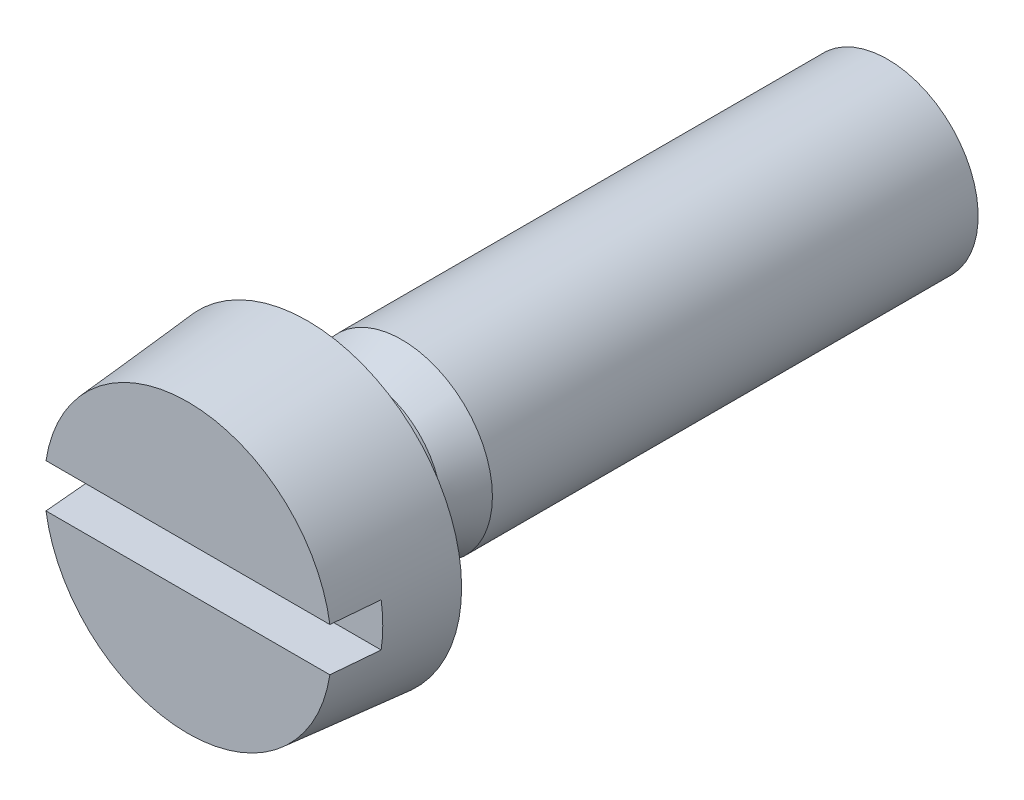
ISO-10303-21;
HEADER;
FILE_DESCRIPTION(('STEP AP214'),'2;1');
FILE_NAME('part.step','',(''),(''),'','','');
FILE_SCHEMA(('AUTOMOTIVE_DESIGN { 1 0 10303 214 1 1 1 1 }'));
ENDSEC;
DATA;
#1=APPLICATION_CONTEXT('core data for automotive mechanical design processes');
#2=APPLICATION_PROTOCOL_DEFINITION('international standard','automotive_design',2000,#1);
#3=PRODUCT_CONTEXT('',#1,'mechanical');
#4=PRODUCT('Part','Part','',(#3));
#5=PRODUCT_RELATED_PRODUCT_CATEGORY('part','',(#4));
#6=PRODUCT_DEFINITION_FORMATION('','',#4);
#7=PRODUCT_DEFINITION_CONTEXT('part definition',#1,'design');
#8=PRODUCT_DEFINITION('design','',#6,#7);
#9=PRODUCT_DEFINITION_SHAPE('','',#8);
#10=(LENGTH_UNIT() NAMED_UNIT(*) SI_UNIT(.MILLI.,.METRE.));
#11=(NAMED_UNIT(*) PLANE_ANGLE_UNIT() SI_UNIT($,.RADIAN.));
#12=(NAMED_UNIT(*) SI_UNIT($,.STERADIAN.) SOLID_ANGLE_UNIT());
#13=UNCERTAINTY_MEASURE_WITH_UNIT(LENGTH_MEASURE(1.E-05),#10,'distance_accuracy_value','');
#14=(GEOMETRIC_REPRESENTATION_CONTEXT(3) GLOBAL_UNCERTAINTY_ASSIGNED_CONTEXT((#13)) GLOBAL_UNIT_ASSIGNED_CONTEXT((#10,
#11,#12)) REPRESENTATION_CONTEXT('',''));
#15=CARTESIAN_POINT('',(0.,0.,0.));
#16=DIRECTION('',(0.,0.,1.));
#17=DIRECTION('',(1.,0.,0.));
#18=AXIS2_PLACEMENT_3D('',#15,#16,#17);
#19=CARTESIAN_POINT('',(0.,0.,-16.));
#20=DIRECTION('',(0.,0.,1.));
#21=DIRECTION('',(1.,0.,0.));
#22=AXIS2_PLACEMENT_3D('',#19,#20,#21);
#23=PLANE('',#22);
#24=CARTESIAN_POINT('',(0.,0.,-16.));
#25=DIRECTION('',(0.,0.,-1.));
#26=DIRECTION('',(-1.,0.,0.));
#27=AXIS2_PLACEMENT_3D('',#24,#25,#26);
#28=CIRCLE('',#27,2.5);
#29=CARTESIAN_POINT('',(-2.5,0.,-16.));
#30=VERTEX_POINT('',#29);
#31=EDGE_CURVE('E20',#30,#30,#28,.F.);
#32=ORIENTED_EDGE('',*,*,#31,.F.);
#33=EDGE_LOOP('',(#32));
#34=FACE_BOUND('',#33,.T.);
#35=ADVANCED_FACE('F16',(#34),#23,.F.);
#36=CARTESIAN_POINT('',(0.,0.,-2.6));
#37=DIRECTION('',(0.,0.,-1.));
#38=DIRECTION('',(-1.,0.,0.));
#39=AXIS2_PLACEMENT_3D('',#36,#37,#38);
#40=CYLINDRICAL_SURFACE('',#39,2.5);
#41=CARTESIAN_POINT('',(0.,0.,-2.60000000014315));
#42=DIRECTION('',(0.,0.,-1.));
#43=DIRECTION('',(1.,0.,0.));
#44=AXIS2_PLACEMENT_3D('',#41,#42,#43);
#45=CIRCLE('',#44,2.49999999979878);
#46=CARTESIAN_POINT('',(2.49999999979878,0.,-2.60000000014315));
#47=VERTEX_POINT('',#46);
#48=EDGE_CURVE('E142',#47,#47,#45,.F.);
#49=ORIENTED_EDGE('',*,*,#48,.F.);
#50=EDGE_LOOP('',(#49));
#51=FACE_BOUND('',#50,.T.);
#52=ORIENTED_EDGE('',*,*,#31,.T.);
#53=EDGE_LOOP('',(#52));
#54=FACE_BOUND('',#53,.T.);
#55=ADVANCED_FACE('F129',(#51,#54),#40,.T.);
#56=CARTESIAN_POINT('',(0.,0.,-2.60000000014315));
#57=DIRECTION('',(0.,0.,-1.));
#58=DIRECTION('',(-1.,0.,0.));
#59=AXIS2_PLACEMENT_3D('',#56,#57,#58);
#60=CONICAL_SURFACE('',#59,2.49999999979878,0.380506376686039);
#61=CARTESIAN_POINT('',(0.,0.,-1.6));
#62=DIRECTION('',(0.,0.,-1.));
#63=DIRECTION('',(-1.,0.,0.));
#64=AXIS2_PLACEMENT_3D('',#61,#62,#63);
#65=CIRCLE('',#64,2.1);
#66=CARTESIAN_POINT('',(-2.1,0.,-1.6));
#67=VERTEX_POINT('',#66);
#68=EDGE_CURVE('E75',#67,#67,#65,.F.);
#69=ORIENTED_EDGE('',*,*,#68,.F.);
#70=EDGE_LOOP('',(#69));
#71=FACE_BOUND('',#70,.T.);
#72=ORIENTED_EDGE('',*,*,#48,.T.);
#73=EDGE_LOOP('',(#72));
#74=FACE_BOUND('',#73,.T.);
#75=ADVANCED_FACE('F125',(#71,#74),#60,.T.);
#76=CARTESIAN_POINT('',(0.,0.,-0.2));
#77=DIRECTION('',(0.,0.,-1.));
#78=DIRECTION('',(-1.,0.,0.));
#79=AXIS2_PLACEMENT_3D('',#76,#77,#78);
#80=CYLINDRICAL_SURFACE('',#79,2.1);
#81=CARTESIAN_POINT('',(0.,0.,-0.2));
#82=DIRECTION('',(0.,0.,1.));
#83=DIRECTION('',(1.,0.,0.));
#84=AXIS2_PLACEMENT_3D('',#81,#82,#83);
#85=CIRCLE('',#84,2.1);
#86=CARTESIAN_POINT('',(2.1,0.,-0.2));
#87=VERTEX_POINT('',#86);
#88=EDGE_CURVE('E65',#87,#87,#85,.T.);
#89=ORIENTED_EDGE('',*,*,#88,.F.);
#90=EDGE_LOOP('',(#89));
#91=FACE_BOUND('',#90,.T.);
#92=ORIENTED_EDGE('',*,*,#68,.T.);
#93=EDGE_LOOP('',(#92));
#94=FACE_BOUND('',#93,.T.);
#95=ADVANCED_FACE('F122',(#91,#94),#80,.T.);
#96=CARTESIAN_POINT('',(4.25,0.,2.));
#97=DIRECTION('',(0.,0.,-1.));
#98=DIRECTION('',(-1.,0.,0.));
#99=AXIS2_PLACEMENT_3D('',#96,#97,#98);
#100=PLANE('',#99);
#101=DIRECTION('',(1.,0.,0.));
#102=VECTOR('',#101,1.);
#103=CARTESIAN_POINT('',(0.,-0.6,2.));
#104=LINE('',#103,#102);
#105=CARTESIAN_POINT('',(4.03060910847677,-0.6,2.00000000000477));
#106=VERTEX_POINT('',#105);
#107=CARTESIAN_POINT('',(-4.03060910847658,-0.6,2.00000000000704));
#108=VERTEX_POINT('',#107);
#109=EDGE_CURVE('E73',#106,#108,#104,.F.);
#110=ORIENTED_EDGE('',*,*,#109,.F.);
#111=CARTESIAN_POINT('',(0.,0.,2.00000000000955));
#112=DIRECTION('',(0.,0.,-1.));
#113=DIRECTION('',(-1.,0.,0.));
#114=AXIS2_PLACEMENT_3D('',#111,#112,#113);
#115=CIRCLE('',#114,4.07502267298386);
#116=CARTESIAN_POINT('',(4.03060910847658,0.6,2.00000000000704));
#117=VERTEX_POINT('',#116);
#118=EDGE_CURVE('E57',#117,#106,#115,.T.);
#119=ORIENTED_EDGE('',*,*,#118,.F.);
#120=DIRECTION('',(1.,0.,0.));
#121=VECTOR('',#120,1.);
#122=CARTESIAN_POINT('',(0.,0.6,2.));
#123=LINE('',#122,#121);
#124=CARTESIAN_POINT('',(-4.03060910847677,0.6,2.00000000000477));
#125=VERTEX_POINT('',#124);
#126=EDGE_CURVE('E64',#117,#125,#123,.F.);
#127=ORIENTED_EDGE('',*,*,#126,.T.);
#128=CARTESIAN_POINT('',(0.,0.,2.00000000000955));
#129=DIRECTION('',(0.,0.,-1.));
#130=DIRECTION('',(-1.,0.,0.));
#131=AXIS2_PLACEMENT_3D('',#128,#129,#130);
#132=CIRCLE('',#131,4.07502267298386);
#133=EDGE_CURVE('E74',#108,#125,#132,.T.);
#134=ORIENTED_EDGE('',*,*,#133,.F.);
#135=EDGE_LOOP('',(#110,#119,#127,#134));
#136=FACE_BOUND('',#135,.T.);
#137=ADVANCED_FACE('F69',(#136),#100,.F.);
#138=CARTESIAN_POINT('',(0.,0.,-0.2));
#139=DIRECTION('',(0.,0.,-1.));
#140=DIRECTION('',(-1.,0.,0.));
#141=AXIS2_PLACEMENT_3D('',#138,#139,#140);
#142=TOROIDAL_SURFACE('',#141,2.3,0.2);
#143=ORIENTED_EDGE('',*,*,#88,.T.);
#144=EDGE_LOOP('',(#143));
#145=FACE_BOUND('',#144,.T.);
#146=CARTESIAN_POINT('',(2.3,0.,0.));
#147=CARTESIAN_POINT('',(2.29999409618129,0.0364102173988052,0.));
#148=CARTESIAN_POINT('',(2.29915003783443,0.072821840053788,0.));
#149=CARTESIAN_POINT('',(2.29577050631826,0.145323675056289,0.));
#150=CARTESIAN_POINT('',(2.29324631319132,0.181414415065721,0.));
#151=CARTESIAN_POINT('',(2.28650710486973,0.253274883007128,0.));
#152=CARTESIAN_POINT('',(2.28229972774912,0.289045324698426,0.));
#153=CARTESIAN_POINT('',(2.27219868300902,0.36026482452331,0.));
#154=CARTESIAN_POINT('',(2.26630885383113,0.395714426838045,0.));
#155=CARTESIAN_POINT('',(2.25284655643153,0.466292558170426,0.));
#156=CARTESIAN_POINT('',(2.24527409520704,0.501421088522617,0.));
#157=CARTESIAN_POINT('',(2.22845042494949,0.571357620808431,0.));
#158=CARTESIAN_POINT('',(2.21919546007048,0.606164718764165,0.));
#159=CARTESIAN_POINT('',(2.19901058790181,0.67545954699475,0.));
#160=CARTESIAN_POINT('',(2.18807333172563,0.70994513564542,0.));
#161=CARTESIAN_POINT('',(2.16452715790391,0.778597545795366,0.));
#162=CARTESIAN_POINT('',(2.15190755618997,0.812760696332256,0.));
#163=CARTESIAN_POINT('',(2.123993456011,0.883319062421612,0.));
#164=CARTESIAN_POINT('',(2.10856330856583,0.919660706364918,0.));
#165=CARTESIAN_POINT('',(2.07599813208921,0.991241651408022,0.));
#166=CARTESIAN_POINT('',(2.05887685512594,1.02648720381889,0.));
#167=CARTESIAN_POINT('',(2.02293364013126,1.09587699112555,0.));
#168=CARTESIAN_POINT('',(2.00412065013235,1.13002585814584,0.));
#169=CARTESIAN_POINT('',(1.96479908094891,1.19722406507501,0.));
#170=CARTESIAN_POINT('',(1.9442946485582,1.23027583090648,0.));
#171=CARTESIAN_POINT('',(1.90159496689467,1.29528213260777,0.));
#172=CARTESIAN_POINT('',(1.87939923149788,1.32723634915587,0.));
#173=CARTESIAN_POINT('',(1.83332170639545,1.39005050352958,0.));
#174=CARTESIAN_POINT('',(1.80943511700328,1.42090691948332,0.));
#175=CARTESIAN_POINT('',(1.75997965158032,1.48152840155959,0.));
#176=CARTESIAN_POINT('',(1.73440210969796,1.51128639442713,0.));
#177=CARTESIAN_POINT('',(1.68157029575988,1.56971596654893,0.));
#178=CARTESIAN_POINT('',(1.65430405868117,1.59837671668274,0.));
#179=CARTESIAN_POINT('',(1.59844173730582,1.6542598539001,0.));
#180=CARTESIAN_POINT('',(1.56984835418208,1.68148494077211,0.));
#181=CARTESIAN_POINT('',(1.51153293311259,1.73424487948472,0.));
#182=CARTESIAN_POINT('',(1.48182104808532,1.7597909420791,0.));
#183=CARTESIAN_POINT('',(1.4212743447185,1.80919714869156,0.));
#184=CARTESIAN_POINT('',(1.39044589722874,1.83306509713022,0.));
#185=CARTESIAN_POINT('',(1.32766941816274,1.87911829310299,0.));
#186=CARTESIAN_POINT('',(1.29572422950101,1.90130741482662,0.));
#187=CARTESIAN_POINT('',(1.23071788794243,1.94400704462784,0.));
#188=CARTESIAN_POINT('',(1.19765641572891,1.96451706654793,0.));
#189=CARTESIAN_POINT('',(1.13042068827493,2.00386320186289,0.));
#190=CARTESIAN_POINT('',(1.09624342660388,2.02269417635475,0.));
#191=CARTESIAN_POINT('',(1.02677833508644,2.05868589952359,0.));
#192=CARTESIAN_POINT('',(0.991485360505604,2.07583671124069,0.));
#193=CARTESIAN_POINT('',(0.919792322751314,2.10847676716669,0.));
#194=CARTESIAN_POINT('',(0.883385581248627,2.12395133111302,0.));
#195=CARTESIAN_POINT('',(0.812799713788581,2.15190666088039,0.));
#196=CARTESIAN_POINT('',(0.778676186947937,2.16452800822264,0.));
#197=CARTESIAN_POINT('',(0.710091079726871,2.18807561347969,0.));
#198=CARTESIAN_POINT('',(0.675633037317789,2.19901215686653,0.));
#199=CARTESIAN_POINT('',(0.606382549099449,2.21919668469889,0.));
#200=CARTESIAN_POINT('',(0.571592112253169,2.22845155954022,0.));
#201=CARTESIAN_POINT('',(0.501677829150026,2.24527534552235,0.));
#202=CARTESIAN_POINT('',(0.46655476936009,2.2528475232579,0.));
#203=CARTESIAN_POINT('',(0.395976553462711,2.26630981502294,0.));
#204=CARTESIAN_POINT('',(0.360521298100382,2.27219940862224,0.));
#205=CARTESIAN_POINT('',(0.289279500189126,2.28230044254163,0.));
#206=CARTESIAN_POINT('',(0.253492339299253,2.28650751834666,0.));
#207=CARTESIAN_POINT('',(0.181587130711443,2.29324684280813,0.));
#208=CARTESIAN_POINT('',(0.145468319508177,2.29577092751123,0.));
#209=CARTESIAN_POINT('',(0.0729001058964696,2.29915007225184,0.));
#210=CARTESIAN_POINT('',(0.0364501584498876,2.29999333246596,0.));
#211=CARTESIAN_POINT('',(-0.0363735454515744,2.30000665351984,0.));
#212=CARTESIAN_POINT('',(-0.0727473010203893,2.29918022745902,0.));
#213=CARTESIAN_POINT('',(-0.145184901312607,2.29582822522652,0.));
#214=CARTESIAN_POINT('',(-0.181249244175259,2.29331350682746,0.));
#215=CARTESIAN_POINT('',(-0.253067364124713,2.28659054505284,0.));
#216=CARTESIAN_POINT('',(-0.288821809373043,2.28238945011953,0.));
#217=CARTESIAN_POINT('',(-0.360020071676467,2.27229698186265,0.));
#218=CARTESIAN_POINT('',(-0.395464359996195,2.26640893549819,0.));
#219=CARTESIAN_POINT('',(-0.466042565155552,2.2529465775599,0.));
#220=CARTESIAN_POINT('',(-0.501176382723964,2.24537174558259,0.));
#221=CARTESIAN_POINT('',(-0.571134258164147,2.22853967337792,0.));
#222=CARTESIAN_POINT('',(-0.605957284171446,2.219278146909,0.));
#223=CARTESIAN_POINT('',(-0.675294689152177,2.19907633240386,0.));
#224=CARTESIAN_POINT('',(-0.709806773671841,2.18812817344951,0.));
#225=CARTESIAN_POINT('',(-0.778523183485063,2.16455703921444,0.));
#226=CARTESIAN_POINT('',(-0.812723666306209,2.15192288232516,0.));
#227=CARTESIAN_POINT('',(-0.883318810952361,2.12399282305976,0.));
#228=CARTESIAN_POINT('',(-0.919660639232657,2.1085631395931,0.));
#229=CARTESIAN_POINT('',(-0.991241718033384,2.07599829978612,0.));
#230=CARTESIAN_POINT('',(-1.02648722162808,2.05887689995193,0.));
#231=CARTESIAN_POINT('',(-1.09587697340552,2.02293359552978,0.));
#232=CARTESIAN_POINT('',(-1.13002585340292,2.00412063819442,0.));
#233=CARTESIAN_POINT('',(-1.19722406980656,1.96479909285836,0.));
#234=CARTESIAN_POINT('',(-1.23027583217458,1.9442946517501,0.));
#235=CARTESIAN_POINT('',(-1.29528213133923,1.90159496370181,0.));
#236=CARTESIAN_POINT('',(-1.32723634881541,1.879399230641,0.));
#237=CARTESIAN_POINT('',(-1.39005050387099,1.83332170725484,0.));
#238=CARTESIAN_POINT('',(-1.42090691957504,1.8094351172342,0.));
#239=CARTESIAN_POINT('',(-1.48152840146731,1.75997965134808,0.));
#240=CARTESIAN_POINT('',(-1.5112863944023,1.7344021096355,0.));
#241=CARTESIAN_POINT('',(-1.56971596657393,1.68157029582284,0.));
#242=CARTESIAN_POINT('',(-1.59837671668943,1.65430405869802,0.));
#243=CARTESIAN_POINT('',(-1.65425985389338,1.59844173728905,0.));
#244=CARTESIAN_POINT('',(-1.68148494077025,1.56984835417768,0.));
#245=CARTESIAN_POINT('',(-1.73424487948634,1.51153293311721,0.));
#246=CARTESIAN_POINT('',(-1.7597909420794,1.48182104808671,0.));
#247=CARTESIAN_POINT('',(-1.80919714869087,1.42127434471756,0.));
#248=CARTESIAN_POINT('',(-1.83306509712986,1.39044589722869,0.));
#249=CARTESIAN_POINT('',(-1.87911829310286,1.32766941816335,0.));
#250=CARTESIAN_POINT('',(-1.90130741482639,1.2957242295014,0.));
#251=CARTESIAN_POINT('',(-1.94400704462755,1.23071788794265,0.));
#252=CARTESIAN_POINT('',(-1.96451706654766,1.19765641572919,0.));
#253=CARTESIAN_POINT('',(-2.00386320186267,1.13042068827522,0.));
#254=CARTESIAN_POINT('',(-2.02269417635453,1.09624342660414,0.));
#255=CARTESIAN_POINT('',(-2.05868589952341,1.02677833508664,0.));
#256=CARTESIAN_POINT('',(-2.07583671124055,0.991485360505769,0.));
#257=CARTESIAN_POINT('',(-2.10847676716661,0.919792322751406,0.));
#258=CARTESIAN_POINT('',(-2.12395133111298,0.883385581248673,0.));
#259=CARTESIAN_POINT('',(-2.15190666088039,0.812799713788629,0.));
#260=CARTESIAN_POINT('',(-2.16452800822264,0.778676186948034,0.));
#261=CARTESIAN_POINT('',(-2.18807561347969,0.710091079727051,0.));
#262=CARTESIAN_POINT('',(-2.19901215686653,0.675633037318003,0.));
#263=CARTESIAN_POINT('',(-2.21919668469889,0.606382549099718,0.));
#264=CARTESIAN_POINT('',(-2.22845155954022,0.571592112253458,0.));
#265=CARTESIAN_POINT('',(-2.24527534552235,0.501677829150343,0.));
#266=CARTESIAN_POINT('',(-2.2528475232579,0.466554769360413,0.));
#267=CARTESIAN_POINT('',(-2.26630981502294,0.395976553463035,0.));
#268=CARTESIAN_POINT('',(-2.27219940862224,0.360521298100699,0.));
#269=CARTESIAN_POINT('',(-2.28230044254163,0.289279500189414,0.));
#270=CARTESIAN_POINT('',(-2.28650751834666,0.253492339299522,0.));
#271=CARTESIAN_POINT('',(-2.29324684280813,0.181587130711656,0.));
#272=CARTESIAN_POINT('',(-2.29577092751123,0.145468319508356,0.));
#273=CARTESIAN_POINT('',(-2.29915007225184,0.0729001058965661,0.));
#274=CARTESIAN_POINT('',(-2.29999333246596,0.036450158449936,0.));
#275=CARTESIAN_POINT('',(-2.30000665351984,-0.0363735454515743,0.));
#276=CARTESIAN_POINT('',(-2.29918022745902,-0.0727473010203894,0.));
#277=CARTESIAN_POINT('',(-2.29582822522653,-0.145184901312608,0.));
#278=CARTESIAN_POINT('',(-2.29331350682746,-0.181249244175259,0.));
#279=CARTESIAN_POINT('',(-2.28659054505284,-0.253067364124714,0.));
#280=CARTESIAN_POINT('',(-2.28238945011953,-0.288821809373044,0.));
#281=CARTESIAN_POINT('',(-2.27229698186265,-0.360020071676468,0.));
#282=CARTESIAN_POINT('',(-2.26640893549819,-0.395464359996196,0.));
#283=CARTESIAN_POINT('',(-2.2529465775599,-0.466042565155553,0.));
#284=CARTESIAN_POINT('',(-2.24537174558259,-0.501176382723965,0.));
#285=CARTESIAN_POINT('',(-2.22853967337792,-0.571134258164149,0.));
#286=CARTESIAN_POINT('',(-2.219278146909,-0.605957284171447,0.));
#287=CARTESIAN_POINT('',(-2.19907633240387,-0.675294689152178,0.));
#288=CARTESIAN_POINT('',(-2.18812817344951,-0.709806773671842,0.));
#289=CARTESIAN_POINT('',(-2.16455703921444,-0.778523183485063,0.));
#290=CARTESIAN_POINT('',(-2.15192288232516,-0.812723666306209,0.));
#291=CARTESIAN_POINT('',(-2.12399282305975,-0.883318810952385,0.));
#292=CARTESIAN_POINT('',(-2.10856313959308,-0.919660639232704,0.));
#293=CARTESIAN_POINT('',(-2.07599829978609,-0.99124171803347,0.));
#294=CARTESIAN_POINT('',(-2.05887689995189,-1.02648722162818,0.));
#295=CARTESIAN_POINT('',(-2.02293359552973,-1.09587697340565,0.));
#296=CARTESIAN_POINT('',(-2.00412063819437,-1.13002585340306,0.));
#297=CARTESIAN_POINT('',(-1.9647990928583,-1.19722406980671,0.));
#298=CARTESIAN_POINT('',(-1.94429465175004,-1.23027583217474,0.));
#299=CARTESIAN_POINT('',(-1.90159496370175,-1.29528213133938,0.));
#300=CARTESIAN_POINT('',(-1.87939923064094,-1.32723634881556,0.));
#301=CARTESIAN_POINT('',(-1.83332170725479,-1.39005050387113,0.));
#302=CARTESIAN_POINT('',(-1.80943511723415,-1.42090691957517,0.));
#303=CARTESIAN_POINT('',(-1.75997965134804,-1.48152840146741,0.));
#304=CARTESIAN_POINT('',(-1.73440210963546,-1.51128639440239,0.));
#305=CARTESIAN_POINT('',(-1.68157029582282,-1.56971596657398,0.));
#306=CARTESIAN_POINT('',(-1.65430405869801,-1.59837671668946,0.));
#307=CARTESIAN_POINT('',(-1.59844173728902,-1.65425985389339,0.));
#308=CARTESIAN_POINT('',(-1.56984835417763,-1.68148494077027,0.));
#309=CARTESIAN_POINT('',(-1.51153293311712,-1.73424487948638,0.));
#310=CARTESIAN_POINT('',(-1.4818210480866,-1.75979094207945,0.));
#311=CARTESIAN_POINT('',(-1.42127434471742,-1.80919714869094,0.));
#312=CARTESIAN_POINT('',(-1.39044589722854,-1.83306509712993,0.));
#313=CARTESIAN_POINT('',(-1.32766941816319,-1.87911829310294,0.));
#314=CARTESIAN_POINT('',(-1.29572422950122,-1.90130741482647,0.));
#315=CARTESIAN_POINT('',(-1.23071788794248,-1.94400704462763,0.));
#316=CARTESIAN_POINT('',(-1.19765641572902,-1.96451706654774,0.));
#317=CARTESIAN_POINT('',(-1.13042068827507,-2.00386320186274,0.));
#318=CARTESIAN_POINT('',(-1.096243426604,-2.0226941763546,0.));
#319=CARTESIAN_POINT('',(-1.02677833508652,-2.05868589952346,0.));
#320=CARTESIAN_POINT('',(-0.991485360505675,-2.07583671124059,0.));
#321=CARTESIAN_POINT('',(-0.919792322751355,-2.10847676716663,0.));
#322=CARTESIAN_POINT('',(-0.883385581248648,-2.12395133111299,0.));
#323=CARTESIAN_POINT('',(-0.812799713788626,-2.1519066608804,0.));
#324=CARTESIAN_POINT('',(-0.778676186948028,-2.16452800822264,0.));
#325=CARTESIAN_POINT('',(-0.710091079727039,-2.18807561347969,0.));
#326=CARTESIAN_POINT('',(-0.675633037317988,-2.19901215686653,0.));
#327=CARTESIAN_POINT('',(-0.6063825490997,-2.21919668469889,0.));
#328=CARTESIAN_POINT('',(-0.571592112253439,-2.22845155954022,0.));
#329=CARTESIAN_POINT('',(-0.501677829150321,-2.24527534552235,0.));
#330=CARTESIAN_POINT('',(-0.466554769360391,-2.2528475232579,0.));
#331=CARTESIAN_POINT('',(-0.395976553463013,-2.26630981502294,0.));
#332=CARTESIAN_POINT('',(-0.360521298100677,-2.27219940862224,0.));
#333=CARTESIAN_POINT('',(-0.289279500189395,-2.28230044254163,0.));
#334=CARTESIAN_POINT('',(-0.253492339299503,-2.28650751834666,0.));
#335=CARTESIAN_POINT('',(-0.181587130711641,-2.29324684280813,0.));
#336=CARTESIAN_POINT('',(-0.145468319508344,-2.29577092751124,0.));
#337=CARTESIAN_POINT('',(-0.0729001058965596,-2.29915007225184,0.));
#338=CARTESIAN_POINT('',(-0.0364501584499328,-2.29999333246597,0.));
#339=CARTESIAN_POINT('',(0.0363735454515708,-2.30000665351984,0.));
#340=CARTESIAN_POINT('',(0.0727473010203826,-2.29918022745902,0.));
#341=CARTESIAN_POINT('',(0.145184901312595,-2.29582822522653,0.));
#342=CARTESIAN_POINT('',(0.181249244175244,-2.29331350682746,0.));
#343=CARTESIAN_POINT('',(0.253067364124695,-2.28659054505284,0.));
#344=CARTESIAN_POINT('',(0.288821809373024,-2.28238945011953,0.));
#345=CARTESIAN_POINT('',(0.360020071676446,-2.27229698186265,0.));
#346=CARTESIAN_POINT('',(0.395464359996173,-2.26640893549819,0.));
#347=CARTESIAN_POINT('',(0.46604256515553,-2.2529465775599,0.));
#348=CARTESIAN_POINT('',(0.501176382723943,-2.24537174558259,0.));
#349=CARTESIAN_POINT('',(0.571134258164128,-2.22853967337792,0.));
#350=CARTESIAN_POINT('',(0.605957284171428,-2.219278146909,0.));
#351=CARTESIAN_POINT('',(0.675294689152163,-2.19907633240387,0.));
#352=CARTESIAN_POINT('',(0.709806773671829,-2.18812817344951,0.));
#353=CARTESIAN_POINT('',(0.778523183485056,-2.16455703921445,0.));
#354=CARTESIAN_POINT('',(0.812723666306205,-2.15192288232516,0.));
#355=CARTESIAN_POINT('',(0.883318810952382,-2.12399282305976,0.));
#356=CARTESIAN_POINT('',(0.919660639232699,-2.10856313959309,0.));
#357=CARTESIAN_POINT('',(0.991241718033458,-2.0759982997861,0.));
#358=CARTESIAN_POINT('',(1.02648722162816,-2.0588768999519,0.));
#359=CARTESIAN_POINT('',(1.09587697340564,-2.02293359552975,0.));
#360=CARTESIAN_POINT('',(1.13002585340307,-2.0041206381944,0.));
#361=CARTESIAN_POINT('',(1.19722406980667,-1.96479909285831,0.));
#362=CARTESIAN_POINT('',(1.23027583217463,-1.94429465175003,0.));
#363=CARTESIAN_POINT('',(1.29528213133945,-1.90159496370181,0.));
#364=CARTESIAN_POINT('',(1.32723634881586,-1.87939923064108,0.));
#365=CARTESIAN_POINT('',(1.39005050387079,-1.83332170725468,0.));
#366=CARTESIAN_POINT('',(1.42090691957396,-1.80943511723369,0.));
#367=CARTESIAN_POINT('',(1.48152840146859,-1.75997965134853,0.));
#368=CARTESIAN_POINT('',(1.51128639440685,-1.73440210963726,0.));
#369=CARTESIAN_POINT('',(1.56971596656946,-1.68157029582104,0.));
#370=CARTESIAN_POINT('',(1.59837671667255,-1.65430405869129,0.));
#371=CARTESIAN_POINT('',(1.65425985391028,-1.59844173729573,0.));
#372=CARTESIAN_POINT('',(1.68148494083323,-1.56984835420265,0.));
#373=CARTESIAN_POINT('',(1.73424487942398,-1.51153293309221,0.));
#374=CARTESIAN_POINT('',(1.75979094184725,-1.48182104799409,0.));
#375=CARTESIAN_POINT('',(1.80919714892212,-1.42127434480933,0.));
#376=CARTESIAN_POINT('',(1.83306509799028,-1.39044589757085,0.));
#377=CARTESIAN_POINT('',(1.87911829224482,-1.32766941782151,0.));
#378=CARTESIAN_POINT('',(1.90130741162781,-1.29572422822798,0.));
#379=CARTESIAN_POINT('',(1.94400704782741,-1.2307178892159,0.));
#380=CARTESIAN_POINT('',(1.96451707848973,-1.19765642048196,0.));
#381=CARTESIAN_POINT('',(2.00386318988556,-1.13042068350786,0.));
#382=CARTESIAN_POINT('',(2.02269413159332,-1.09624340878827,0.));
#383=CARTESIAN_POINT('',(2.05868594453539,-1.0267783530018,0.));
#384=CARTESIAN_POINT('',(2.0758368796802,-0.991485427546894,0.));
#385=CARTESIAN_POINT('',(2.10847659735439,-0.919792255163691,0.));
#386=CARTESIAN_POINT('',(2.12395069484461,-0.883385328005006,0.));
#387=CARTESIAN_POINT('',(2.15192200342766,-0.812762687069202,0.));
#388=CARTESIAN_POINT('',(2.16455792570418,-0.778601832279155,0.));
#389=CARTESIAN_POINT('',(2.18813052342048,-0.709952730895044,0.));
#390=CARTESIAN_POINT('',(2.19907798456618,-0.675468194891518,0.));
#391=CARTESIAN_POINT('',(2.21927947182332,-0.606175135196456,0.));
#392=CARTESIAN_POINT('',(2.22854091146259,-0.571368773633757,0.));
#393=CARTESIAN_POINT('',(2.24537312322328,-0.501433144062826,0.));
#394=CARTESIAN_POINT('',(2.25294769304235,-0.466304790625408,0.));
#395=CARTESIAN_POINT('',(2.26640999484007,-0.395726519417629,0.));
#396=CARTESIAN_POINT('',(2.27229773379318,-0.360276602977445,0.));
#397=CARTESIAN_POINT('',(2.2823903699015,-0.289055970440034,0.));
#398=CARTESIAN_POINT('',(2.28659141398754,-0.253284708547009,0.));
#399=CARTESIAN_POINT('',(2.29331376327505,-0.181422106244397,0.));
#400=CARTESIAN_POINT('',(2.29582738748827,-0.145330049906448,0.));
#401=CARTESIAN_POINT('',(2.29918163442357,-0.0728250785287198,0.));
#402=CARTESIAN_POINT('',(2.30001090762976,-0.0364116365468228,0.));
#403=CARTESIAN_POINT('',(2.3,0.,0.));
#404=B_SPLINE_CURVE_WITH_KNOTS('',3,(#146,#147,#148,#149,#150,#151,#152,#153,#154,#155,#156,
#157,#158,#159,#160,#161,#162,#163,#164,#165,#166,#167,#168,#169,#170,#171,#172,#173,#174,#175,
#176,#177,#178,#179,#180,#181,#182,#183,#184,#185,#186,#187,#188,#189,#190,#191,#192,#193,#194,
#195,#196,#197,#198,#199,#200,#201,#202,#203,#204,#205,#206,#207,#208,#209,#210,#211,#212,#213,
#214,#215,#216,#217,#218,#219,#220,#221,#222,#223,#224,#225,#226,#227,#228,#229,#230,#231,#232,
#233,#234,#235,#236,#237,#238,#239,#240,#241,#242,#243,#244,#245,#246,#247,#248,#249,#250,#251,
#252,#253,#254,#255,#256,#257,#258,#259,#260,#261,#262,#263,#264,#265,#266,#267,#268,#269,#270,
#271,#272,#273,#274,#275,#276,#277,#278,#279,#280,#281,#282,#283,#284,#285,#286,#287,#288,#289,
#290,#291,#292,#293,#294,#295,#296,#297,#298,#299,#300,#301,#302,#303,#304,#305,#306,#307,#308,
#309,#310,#311,#312,#313,#314,#315,#316,#317,#318,#319,#320,#321,#322,#323,#324,#325,#326,#327,
#328,#329,#330,#331,#332,#333,#334,#335,#336,#337,#338,#339,#340,#341,#342,#343,#344,#345,#346,
#347,#348,#349,#350,#351,#352,#353,#354,#355,#356,#357,#358,#359,#360,#361,#362,#363,#364,#365,
#366,#367,#368,#369,#370,#371,#372,#373,#374,#375,#376,#377,#378,#379,#380,#381,#382,#383,#384,
#385,#386,#387,#388,#389,#390,#391,#392,#393,#394,#395,#396,#397,#398,#399,#400,#401,#402,#403),
.UNSPECIFIED.,.F.,.F.,(4,2,2,2,2,2,2,2,2,2,2,2,2,2,2,2,2,2,2,2,2,2,2,2,2,2,2,2,2,2,2,2,2,2,2,2,
2,2,2,2,2,2,2,2,2,2,2,2,2,2,2,2,2,2,2,2,2,2,2,2,2,2,2,2,2,2,2,2,2,2,2,2,2,2,2,2,2,2,2,2,2,2,2,2,
2,2,2,2,2,2,2,2,2,2,2,2,2,2,2,2,2,2,2,2,2,2,2,2,2,2,2,2,2,2,2,2,2,2,2,2,2,2,2,2,2,2,2,2,4),(0.,
0.109223301179447,0.217720600507267,0.325731038550076,0.433496997065938,0.541262507445466,
0.649271604116774,0.75776667784834,0.866986883891722,0.98538189491044,1.10288298356593,
1.21979551887253,1.33642949275621,1.45309711762048,1.57011033650847,1.68777834394074,
1.80640521453555,1.92480040832576,2.04230159091721,2.15921416019051,2.27584813784588,
2.39251576651496,2.50952901944277,2.62719712084737,2.74582417409199,2.85493457083723,
2.96334994235297,3.07131055533937,3.17905971869769,3.28684217332248,3.39490243390881,
3.50348313838037,3.61282345995299,3.72193396387245,3.83034939223306,3.93831002729965,
4.04605919396771,4.15384164934729,4.26190192435135,4.37048267290544,4.47982308380411,
4.59821809482282,4.7157191834783,4.8326317187849,4.94926569266858,5.06593331753284,
5.18294653642084,5.30061454385311,5.41924141444793,5.53763660823796,5.65513779082928,
5.77205036010251,5.88868433775785,6.00535196642695,6.12236521935485,6.24003332075956,
6.35866037400436,6.46777077074946,6.5761861422651,6.68414675525145,6.79189591860974,
6.89967837323455,7.00773863382095,7.11631933829261,7.22565965986538,7.33477016378484,
7.44318559214545,7.55114622721204,7.6588953938801,7.76667784925968,7.87473812426374,
7.98331887281782,8.0926592837165,8.21105429473528,8.32855538339082,8.44546791869744,
8.56210189258113,8.67876951744539,8.79578273633336,8.91345074376558,9.03207761436032,
9.15047280815044,9.26797399074182,9.38488656001508,9.50152053767043,9.61818816633952,
9.73520141926738,9.85286952067204,9.97149657391675,10.0806069706619,10.1890223421775,
10.2969829551639,10.4047321185221,10.512514573147,10.6205748337334,10.729155538205,
10.8384958597778,10.9476063636972,11.0560217920578,11.1639824271244,11.2717315937925,
11.379514049172,11.4875743241761,11.5961550727302,11.7054954836289,11.8238904946477,
11.9413915833032,12.0583041186098,12.1749380924935,12.2916057173578,12.4086189362457,
12.5262869436779,12.6449138142727,12.7633090080629,12.8808101906543,12.9977227599276,
13.114356737583,13.231024366252,13.3480376191799,13.4657057205845,13.5843327738291,
13.6935633855089,13.8020644378903,13.9100762316083,14.0178423402459,14.1256080033021,
14.2336184633112,14.3421173028588,14.4513448372507),.UNSPECIFIED.);
#405=CARTESIAN_POINT('',(2.3,0.,0.));
#406=VERTEX_POINT('',#405);
#407=EDGE_CURVE('E156',#406,#406,#404,.T.);
#408=ORIENTED_EDGE('',*,*,#407,.F.);
#409=EDGE_LOOP('',(#408));
#410=FACE_BOUND('',#409,.T.);
#411=ADVANCED_FACE('F18',(#145,#410),#142,.F.);
#412=CARTESIAN_POINT('',(0.,0.6,2.65));
#413=DIRECTION('',(0.,1.,0.));
#414=DIRECTION('',(0.,0.,1.));
#415=AXIS2_PLACEMENT_3D('',#412,#413,#414);
#416=PLANE('',#415);
#417=ORIENTED_EDGE('',*,*,#126,.F.);
#418=CARTESIAN_POINT('',(3.91558398563127,0.599999999954676,3.30000000001347));
#419=CARTESIAN_POINT('',(3.93476098026478,0.599999999977338,3.08333387669028));
#420=CARTESIAN_POINT('',(3.95393490448536,0.599999999992446,2.86666748169429));
#421=CARTESIAN_POINT('',(3.99227661210053,0.600000000007554,2.43333414835797));
#422=CARTESIAN_POINT('',(4.01144439549513,0.600000000007554,2.21666721001764));
#423=CARTESIAN_POINT('',(4.03060910847679,0.6,2.00000000000452));
#424=B_SPLINE_CURVE_WITH_KNOTS('',3,(#418,#419,#420,#421,#422,#423),.UNSPECIFIED.,.F.,.F.,(4,2,
4),(0.,0.652539420123535,1.30507884024336),.UNSPECIFIED.);
#425=CARTESIAN_POINT('',(3.91558398566972,0.6,3.30000000002059));
#426=VERTEX_POINT('',#425);
#427=EDGE_CURVE('E53',#426,#117,#424,.T.);
#428=ORIENTED_EDGE('',*,*,#427,.F.);
#429=DIRECTION('',(-1.,0.,0.));
#430=VECTOR('',#429,1.);
#431=CARTESIAN_POINT('',(0.,0.6,3.3));
#432=LINE('',#431,#430);
#433=CARTESIAN_POINT('',(-3.91558398566972,0.6,3.30000000002059));
#434=VERTEX_POINT('',#433);
#435=EDGE_CURVE('E160',#426,#434,#432,.T.);
#436=ORIENTED_EDGE('',*,*,#435,.T.);
#437=CARTESIAN_POINT('',(-4.03060910846961,0.599999999991614,2.00000000000362));
#438=CARTESIAN_POINT('',(-4.01144439548508,0.599999999995807,2.21666721001653));
#439=CARTESIAN_POINT('',(-3.99227661209288,0.599999999998602,2.43333414835712));
#440=CARTESIAN_POINT('',(-3.95393490449303,0.600000000001398,2.86666748169488));
#441=CARTESIAN_POINT('',(-3.93476098028537,0.600000000001398,3.08333387669205));
#442=CARTESIAN_POINT('',(-3.91558398567004,0.6,3.3000000000169));
#443=B_SPLINE_CURVE_WITH_KNOTS('',3,(#437,#438,#439,#440,#441,#442),.UNSPECIFIED.,.F.,.F.,(4,2,
4),(0.,0.652539420119959,1.30507884024363),.UNSPECIFIED.);
#444=EDGE_CURVE('E77',#125,#434,#443,.T.);
#445=ORIENTED_EDGE('',*,*,#444,.F.);
#446=EDGE_LOOP('',(#417,#428,#436,#445));
#447=FACE_BOUND('',#446,.T.);
#448=ADVANCED_FACE('F76',(#447),#416,.F.);
#449=CARTESIAN_POINT('',(0.,-0.6,2.65));
#450=DIRECTION('',(0.,1.,0.));
#451=DIRECTION('',(0.,0.,1.));
#452=AXIS2_PLACEMENT_3D('',#449,#450,#451);
#453=PLANE('',#452);
#454=CARTESIAN_POINT('',(3.91558398563127,-0.599999999954675,3.30000000001347));
#455=CARTESIAN_POINT('',(3.93476098026478,-0.599999999977338,3.08333387669028));
#456=CARTESIAN_POINT('',(3.95393490448536,-0.599999999992446,2.86666748169429));
#457=CARTESIAN_POINT('',(3.99227661210053,-0.600000000007554,2.43333414835797));
#458=CARTESIAN_POINT('',(4.01144439549513,-0.600000000007554,2.21666721001764));
#459=CARTESIAN_POINT('',(4.03060910847679,-0.6,2.00000000000452));
#460=B_SPLINE_CURVE_WITH_KNOTS('',3,(#454,#455,#456,#457,#458,#459),.UNSPECIFIED.,.F.,.F.,(4,2,
4),(0.,0.652539420123535,1.30507884024336),.UNSPECIFIED.);
#461=CARTESIAN_POINT('',(3.91558398566972,-0.6,3.30000000002059));
#462=VERTEX_POINT('',#461);
#463=EDGE_CURVE('E34',#462,#106,#460,.T.);
#464=ORIENTED_EDGE('',*,*,#463,.T.);
#465=ORIENTED_EDGE('',*,*,#109,.T.);
#466=CARTESIAN_POINT('',(-4.03060910846832,-0.599999999990139,2.00000000000377));
#467=CARTESIAN_POINT('',(-4.01144439548443,-0.599999999995069,2.21666721001669));
#468=CARTESIAN_POINT('',(-3.99227661209266,-0.599999999998356,2.43333414835727));
#469=CARTESIAN_POINT('',(-3.95393490449323,-0.600000000001643,2.86666748169499));
#470=CARTESIAN_POINT('',(-3.93476098028558,-0.600000000001643,3.08333387669212));
#471=CARTESIAN_POINT('',(-3.91558398567004,-0.6,3.3000000000169));
#472=B_SPLINE_CURVE_WITH_KNOTS('',3,(#466,#467,#468,#469,#470,#471),.UNSPECIFIED.,.F.,.F.,(4,2,
4),(0.,0.652539420119825,1.30507884024336),.UNSPECIFIED.);
#473=CARTESIAN_POINT('',(-3.91558398566972,-0.6,3.30000000002059));
#474=VERTEX_POINT('',#473);
#475=EDGE_CURVE('E79',#108,#474,#472,.T.);
#476=ORIENTED_EDGE('',*,*,#475,.T.);
#477=DIRECTION('',(-1.,0.,0.));
#478=VECTOR('',#477,1.);
#479=CARTESIAN_POINT('',(0.,-0.6,3.3));
#480=LINE('',#479,#478);
#481=EDGE_CURVE('E88',#474,#462,#480,.F.);
#482=ORIENTED_EDGE('',*,*,#481,.T.);
#483=EDGE_LOOP('',(#464,#465,#476,#482));
#484=FACE_BOUND('',#483,.T.);
#485=ADVANCED_FACE('F97',(#484),#453,.T.);
#486=CARTESIAN_POINT('',(0.,0.,0.));
#487=DIRECTION('',(0.,0.,-1.));
#488=DIRECTION('',(-1.,0.,0.));
#489=AXIS2_PLACEMENT_3D('',#486,#487,#488);
#490=PLANE('',#489);
#491=ORIENTED_EDGE('',*,*,#407,.T.);
#492=EDGE_LOOP('',(#491));
#493=FACE_BOUND('',#492,.T.);
#494=CARTESIAN_POINT('',(0.,0.,0.));
#495=DIRECTION('',(0.,0.,-1.));
#496=DIRECTION('',(-1.,0.,0.));
#497=AXIS2_PLACEMENT_3D('',#494,#495,#496);
#498=CIRCLE('',#497,4.24999999983342);
#499=CARTESIAN_POINT('',(-4.24999999983342,0.,0.));
#500=VERTEX_POINT('',#499);
#501=EDGE_CURVE('E85',#500,#500,#498,.F.);
#502=ORIENTED_EDGE('',*,*,#501,.F.);
#503=EDGE_LOOP('',(#502));
#504=FACE_BOUND('',#503,.T.);
#505=ADVANCED_FACE('F161',(#493,#504),#490,.T.);
#506=CARTESIAN_POINT('',(0.,0.,3.3));
#507=DIRECTION('',(0.,0.,-1.));
#508=DIRECTION('',(-1.,0.,0.));
#509=AXIS2_PLACEMENT_3D('',#506,#507,#508);
#510=PLANE('',#509);
#511=CARTESIAN_POINT('',(0.,0.,3.30000000002428));
#512=DIRECTION('',(0.,0.,-1.));
#513=DIRECTION('',(-1.,0.,0.));
#514=AXIS2_PLACEMENT_3D('',#511,#512,#513);
#515=CIRCLE('',#514,3.9612874105309);
#516=EDGE_CURVE('E26',#434,#426,#515,.T.);
#517=ORIENTED_EDGE('',*,*,#516,.F.);
#518=ORIENTED_EDGE('',*,*,#435,.F.);
#519=EDGE_LOOP('',(#517,#518));
#520=FACE_BOUND('',#519,.T.);
#521=ADVANCED_FACE('F169',(#520),#510,.F.);
#522=CARTESIAN_POINT('',(0.,0.,3.3));
#523=DIRECTION('',(0.,0.,-1.));
#524=DIRECTION('',(-1.,0.,0.));
#525=AXIS2_PLACEMENT_3D('',#522,#523,#524);
#526=PLANE('',#525);
#527=CARTESIAN_POINT('',(0.,0.,3.30000000002428));
#528=DIRECTION('',(0.,0.,-1.));
#529=DIRECTION('',(-1.,0.,0.));
#530=AXIS2_PLACEMENT_3D('',#527,#528,#529);
#531=CIRCLE('',#530,3.9612874105309);
#532=EDGE_CURVE('E11',#462,#474,#531,.T.);
#533=ORIENTED_EDGE('',*,*,#532,.F.);
#534=ORIENTED_EDGE('',*,*,#481,.F.);
#535=EDGE_LOOP('',(#533,#534));
#536=FACE_BOUND('',#535,.T.);
#537=ADVANCED_FACE('F104',(#536),#526,.F.);
#538=CARTESIAN_POINT('',(0.,0.,5.6843418860808E-11));
#539=DIRECTION('',(0.,0.,-1.));
#540=DIRECTION('',(-1.,0.,0.));
#541=AXIS2_PLACEMENT_3D('',#538,#539,#540);
#542=CONICAL_SURFACE('',#541,4.24999999982845,0.0872664624989262);
#543=ORIENTED_EDGE('',*,*,#463,.F.);
#544=ORIENTED_EDGE('',*,*,#532,.T.);
#545=ORIENTED_EDGE('',*,*,#475,.F.);
#546=ORIENTED_EDGE('',*,*,#133,.T.);
#547=ORIENTED_EDGE('',*,*,#444,.T.);
#548=ORIENTED_EDGE('',*,*,#516,.T.);
#549=ORIENTED_EDGE('',*,*,#427,.T.);
#550=ORIENTED_EDGE('',*,*,#118,.T.);
#551=EDGE_LOOP('',(#543,#544,#545,#546,#547,#548,#549,#550));
#552=FACE_BOUND('',#551,.T.);
#553=ORIENTED_EDGE('',*,*,#501,.T.);
#554=EDGE_LOOP('',(#553));
#555=FACE_BOUND('',#554,.T.);
#556=ADVANCED_FACE('F55',(#552,#555),#542,.T.);
#557=CLOSED_SHELL('',(#35,#55,#75,#95,#137,#411,#448,#485,#505,#521,#537,#556));
#558=MANIFOLD_SOLID_BREP('B1',#557);
#559=ADVANCED_BREP_SHAPE_REPRESENTATION('',(#18,#558),#14);
#560=SHAPE_DEFINITION_REPRESENTATION(#9,#559);
ENDSEC;
END-ISO-10303-21;
